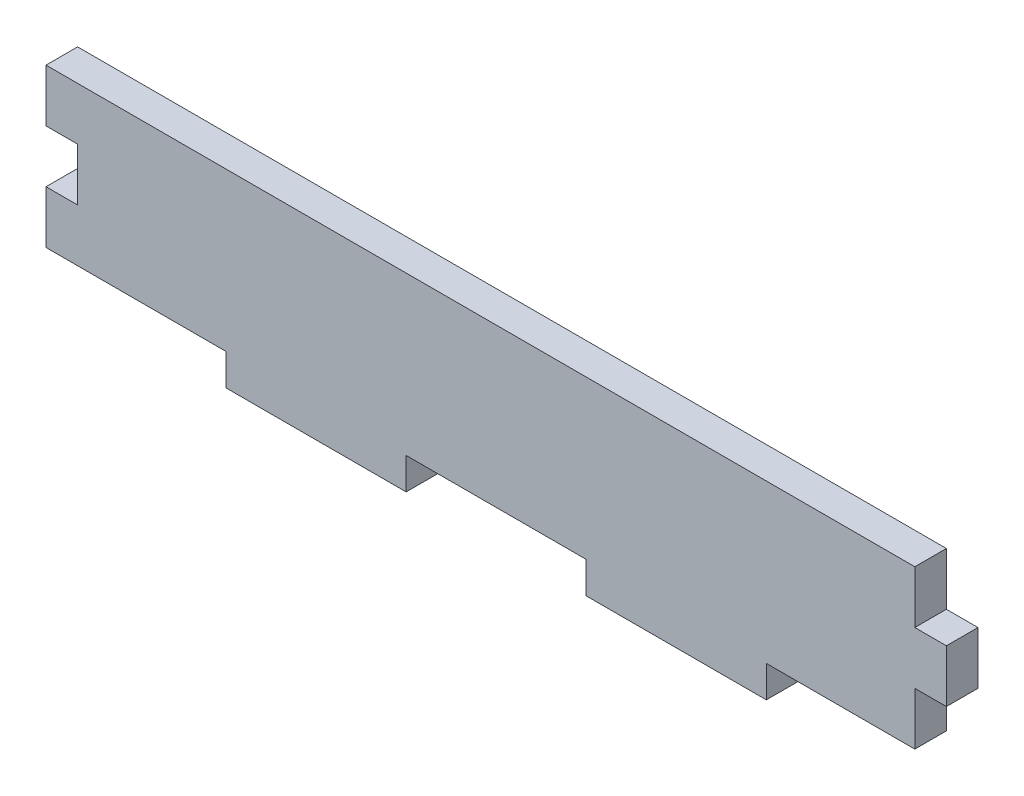
ISO-10303-21;
HEADER;
FILE_DESCRIPTION(('STEP AP214'),'2;1');
FILE_NAME('part.step','',(''),(''),'','','');
FILE_SCHEMA(('AUTOMOTIVE_DESIGN { 1 0 10303 214 1 1 1 1 }'));
ENDSEC;
DATA;
#1=APPLICATION_CONTEXT('core data for automotive mechanical design processes');
#2=APPLICATION_PROTOCOL_DEFINITION('international standard','automotive_design',2000,#1);
#3=PRODUCT_CONTEXT('',#1,'mechanical');
#4=PRODUCT('Part','Part','',(#3));
#5=PRODUCT_RELATED_PRODUCT_CATEGORY('part','',(#4));
#6=PRODUCT_DEFINITION_FORMATION('','',#4);
#7=PRODUCT_DEFINITION_CONTEXT('part definition',#1,'design');
#8=PRODUCT_DEFINITION('design','',#6,#7);
#9=PRODUCT_DEFINITION_SHAPE('','',#8);
#10=(LENGTH_UNIT() NAMED_UNIT(*) SI_UNIT(.MILLI.,.METRE.));
#11=(NAMED_UNIT(*) PLANE_ANGLE_UNIT() SI_UNIT($,.RADIAN.));
#12=(NAMED_UNIT(*) SI_UNIT($,.STERADIAN.) SOLID_ANGLE_UNIT());
#13=UNCERTAINTY_MEASURE_WITH_UNIT(LENGTH_MEASURE(1.E-05),#10,'distance_accuracy_value','');
#14=(GEOMETRIC_REPRESENTATION_CONTEXT(3) GLOBAL_UNCERTAINTY_ASSIGNED_CONTEXT((#13)) GLOBAL_UNIT_ASSIGNED_CONTEXT((#10,
#11,#12)) REPRESENTATION_CONTEXT('',''));
#15=CARTESIAN_POINT('',(0.,0.,0.));
#16=DIRECTION('',(0.,0.,1.));
#17=DIRECTION('',(1.,0.,0.));
#18=AXIS2_PLACEMENT_3D('',#15,#16,#17);
#19=CARTESIAN_POINT('',(0.,0.,5.08));
#20=DIRECTION('',(1.,0.,0.));
#21=DIRECTION('',(0.,0.,-1.));
#22=AXIS2_PLACEMENT_3D('',#19,#20,#21);
#23=PLANE('',#22);
#24=DIRECTION('',(0.,-1.,0.));
#25=VECTOR('',#24,1.);
#26=CARTESIAN_POINT('',(0.,0.,0.));
#27=LINE('',#26,#25);
#28=CARTESIAN_POINT('',(0.,30.48,0.));
#29=VERTEX_POINT('',#28);
#30=CARTESIAN_POINT('',(0.,22.0133333333333,0.));
#31=VERTEX_POINT('',#30);
#32=EDGE_CURVE('E193',#29,#31,#27,.T.);
#33=ORIENTED_EDGE('',*,*,#32,.T.);
#34=DIRECTION('',(0.,0.,1.));
#35=VECTOR('',#34,1.);
#36=CARTESIAN_POINT('',(0.,22.0133333333333,0.));
#37=LINE('',#36,#35);
#38=CARTESIAN_POINT('',(0.,22.0133333333333,5.08));
#39=VERTEX_POINT('',#38);
#40=EDGE_CURVE('E269',#31,#39,#37,.T.);
#41=ORIENTED_EDGE('',*,*,#40,.T.);
#42=DIRECTION('',(0.,-1.,0.));
#43=VECTOR('',#42,1.);
#44=CARTESIAN_POINT('',(0.,0.,5.08));
#45=LINE('',#44,#43);
#46=CARTESIAN_POINT('',(0.,30.48,5.08));
#47=VERTEX_POINT('',#46);
#48=EDGE_CURVE('E213',#47,#39,#45,.T.);
#49=ORIENTED_EDGE('',*,*,#48,.F.);
#50=DIRECTION('',(0.,0.,-1.));
#51=VECTOR('',#50,1.);
#52=CARTESIAN_POINT('',(0.,30.48,5.08));
#53=LINE('',#52,#51);
#54=EDGE_CURVE('E11',#47,#29,#53,.T.);
#55=ORIENTED_EDGE('',*,*,#54,.T.);
#56=EDGE_LOOP('',(#33,#41,#49,#55));
#57=FACE_BOUND('',#56,.T.);
#58=ADVANCED_FACE('F33',(#57),#23,.F.);
#59=CARTESIAN_POINT('',(0.,0.,5.08));
#60=DIRECTION('',(0.,1.,0.));
#61=DIRECTION('',(0.,0.,1.));
#62=AXIS2_PLACEMENT_3D('',#59,#60,#61);
#63=PLANE('',#62);
#64=DIRECTION('',(1.,0.,0.));
#65=VECTOR('',#64,1.);
#66=CARTESIAN_POINT('',(0.,0.,5.08));
#67=LINE('',#66,#65);
#68=CARTESIAN_POINT('',(28.956,0.,5.08));
#69=VERTEX_POINT('',#68);
#70=CARTESIAN_POINT('',(57.912,0.,5.08));
#71=VERTEX_POINT('',#70);
#72=EDGE_CURVE('E225',#69,#71,#67,.T.);
#73=ORIENTED_EDGE('',*,*,#72,.F.);
#74=DIRECTION('',(0.,0.,1.));
#75=VECTOR('',#74,1.);
#76=CARTESIAN_POINT('',(28.956,0.,0.));
#77=LINE('',#76,#75);
#78=CARTESIAN_POINT('',(28.956,0.,0.));
#79=VERTEX_POINT('',#78);
#80=EDGE_CURVE('E245',#79,#69,#77,.T.);
#81=ORIENTED_EDGE('',*,*,#80,.F.);
#82=DIRECTION('',(1.,0.,0.));
#83=VECTOR('',#82,1.);
#84=CARTESIAN_POINT('',(0.,0.,0.));
#85=LINE('',#84,#83);
#86=CARTESIAN_POINT('',(57.912,0.,0.));
#87=VERTEX_POINT('',#86);
#88=EDGE_CURVE('E205',#79,#87,#85,.T.);
#89=ORIENTED_EDGE('',*,*,#88,.T.);
#90=DIRECTION('',(0.,0.,1.));
#91=VECTOR('',#90,1.);
#92=CARTESIAN_POINT('',(57.912,0.,0.));
#93=LINE('',#92,#91);
#94=EDGE_CURVE('E247',#87,#71,#93,.T.);
#95=ORIENTED_EDGE('',*,*,#94,.T.);
#96=EDGE_LOOP('',(#73,#81,#89,#95));
#97=FACE_BOUND('',#96,.T.);
#98=ADVANCED_FACE('F243',(#97),#63,.F.);
#99=CARTESIAN_POINT('',(0.,13.5466666666667,5.08));
#100=VERTEX_POINT('',#99);
#101=CARTESIAN_POINT('',(0.,5.08,5.08));
#102=VERTEX_POINT('',#101);
#103=EDGE_CURVE('E185',#100,#102,#45,.T.);
#104=ORIENTED_EDGE('',*,*,#103,.F.);
#105=DIRECTION('',(0.,0.,1.));
#106=VECTOR('',#105,1.);
#107=CARTESIAN_POINT('',(0.,13.5466666666667,0.));
#108=LINE('',#107,#106);
#109=CARTESIAN_POINT('',(0.,13.5466666666667,0.));
#110=VERTEX_POINT('',#109);
#111=EDGE_CURVE('E173',#110,#100,#108,.T.);
#112=ORIENTED_EDGE('',*,*,#111,.F.);
#113=CARTESIAN_POINT('',(0.,5.08,0.));
#114=VERTEX_POINT('',#113);
#115=EDGE_CURVE('E183',#110,#114,#27,.T.);
#116=ORIENTED_EDGE('',*,*,#115,.T.);
#117=DIRECTION('',(0.,0.,1.));
#118=VECTOR('',#117,1.);
#119=CARTESIAN_POINT('',(0.,5.08,0.));
#120=LINE('',#119,#118);
#121=EDGE_CURVE('E194',#114,#102,#120,.T.);
#122=ORIENTED_EDGE('',*,*,#121,.T.);
#123=EDGE_LOOP('',(#104,#112,#116,#122));
#124=FACE_BOUND('',#123,.T.);
#125=ADVANCED_FACE('F35',(#124),#23,.F.);
#126=CARTESIAN_POINT('',(86.868,0.,5.08));
#127=VERTEX_POINT('',#126);
#128=CARTESIAN_POINT('',(115.824,0.,5.08));
#129=VERTEX_POINT('',#128);
#130=EDGE_CURVE('E219',#127,#129,#67,.T.);
#131=ORIENTED_EDGE('',*,*,#130,.F.);
#132=DIRECTION('',(0.,0.,1.));
#133=VECTOR('',#132,1.);
#134=CARTESIAN_POINT('',(86.868,0.,0.));
#135=LINE('',#134,#133);
#136=CARTESIAN_POINT('',(86.868,0.,0.));
#137=VERTEX_POINT('',#136);
#138=EDGE_CURVE('E251',#137,#127,#135,.T.);
#139=ORIENTED_EDGE('',*,*,#138,.F.);
#140=CARTESIAN_POINT('',(115.824,0.,0.));
#141=VERTEX_POINT('',#140);
#142=EDGE_CURVE('E197',#137,#141,#85,.T.);
#143=ORIENTED_EDGE('',*,*,#142,.T.);
#144=DIRECTION('',(0.,0.,1.));
#145=VECTOR('',#144,1.);
#146=CARTESIAN_POINT('',(115.824,0.,0.));
#147=LINE('',#146,#145);
#148=EDGE_CURVE('E270',#141,#129,#147,.T.);
#149=ORIENTED_EDGE('',*,*,#148,.T.);
#150=EDGE_LOOP('',(#131,#139,#143,#149));
#151=FACE_BOUND('',#150,.T.);
#152=ADVANCED_FACE('F289',(#151),#63,.F.);
#153=CARTESIAN_POINT('',(144.78,0.,5.08));
#154=DIRECTION('',(-1.,0.,0.));
#155=DIRECTION('',(0.,0.,1.));
#156=AXIS2_PLACEMENT_3D('',#153,#154,#155);
#157=PLANE('',#156);
#158=DIRECTION('',(0.,1.,0.));
#159=VECTOR('',#158,1.);
#160=CARTESIAN_POINT('',(144.78,0.,0.));
#161=LINE('',#160,#159);
#162=CARTESIAN_POINT('',(144.78,13.5466666666667,0.));
#163=VERTEX_POINT('',#162);
#164=CARTESIAN_POINT('',(144.78,22.0133333333333,0.));
#165=VERTEX_POINT('',#164);
#166=EDGE_CURVE('E206',#163,#165,#161,.T.);
#167=ORIENTED_EDGE('',*,*,#166,.T.);
#168=DIRECTION('',(0.,0.,1.));
#169=VECTOR('',#168,1.);
#170=CARTESIAN_POINT('',(144.78,22.0133333333333,0.));
#171=LINE('',#170,#169);
#172=CARTESIAN_POINT('',(144.78,22.0133333333333,5.08));
#173=VERTEX_POINT('',#172);
#174=EDGE_CURVE('E426',#165,#173,#171,.T.);
#175=ORIENTED_EDGE('',*,*,#174,.T.);
#176=DIRECTION('',(0.,1.,0.));
#177=VECTOR('',#176,1.);
#178=CARTESIAN_POINT('',(144.78,0.,5.08));
#179=LINE('',#178,#177);
#180=CARTESIAN_POINT('',(144.78,13.5466666666667,5.08));
#181=VERTEX_POINT('',#180);
#182=EDGE_CURVE('E226',#181,#173,#179,.T.);
#183=ORIENTED_EDGE('',*,*,#182,.F.);
#184=DIRECTION('',(0.,0.,1.));
#185=VECTOR('',#184,1.);
#186=CARTESIAN_POINT('',(144.78,13.5466666666667,0.));
#187=LINE('',#186,#185);
#188=EDGE_CURVE('E307',#163,#181,#187,.T.);
#189=ORIENTED_EDGE('',*,*,#188,.F.);
#190=EDGE_LOOP('',(#167,#175,#183,#189));
#191=FACE_BOUND('',#190,.T.);
#192=ADVANCED_FACE('F356',(#191),#157,.F.);
#193=CARTESIAN_POINT('',(0.,30.48,5.08));
#194=DIRECTION('',(0.,-1.,0.));
#195=DIRECTION('',(0.,0.,-1.));
#196=AXIS2_PLACEMENT_3D('',#193,#194,#195);
#197=PLANE('',#196);
#198=DIRECTION('',(-1.,0.,0.));
#199=VECTOR('',#198,1.);
#200=CARTESIAN_POINT('',(0.,30.48,5.08));
#201=LINE('',#200,#199);
#202=CARTESIAN_POINT('',(139.7,30.48,5.08));
#203=VERTEX_POINT('',#202);
#204=EDGE_CURVE('E41',#203,#47,#201,.T.);
#205=ORIENTED_EDGE('',*,*,#204,.F.);
#206=DIRECTION('',(0.,0.,1.));
#207=VECTOR('',#206,1.);
#208=CARTESIAN_POINT('',(139.7,30.48,0.));
#209=LINE('',#208,#207);
#210=CARTESIAN_POINT('',(139.7,30.48,0.));
#211=VERTEX_POINT('',#210);
#212=EDGE_CURVE('E432',#211,#203,#209,.T.);
#213=ORIENTED_EDGE('',*,*,#212,.F.);
#214=DIRECTION('',(-1.,0.,0.));
#215=VECTOR('',#214,1.);
#216=CARTESIAN_POINT('',(0.,30.48,0.));
#217=LINE('',#216,#215);
#218=EDGE_CURVE('E208',#211,#29,#217,.T.);
#219=ORIENTED_EDGE('',*,*,#218,.T.);
#220=ORIENTED_EDGE('',*,*,#54,.F.);
#221=EDGE_LOOP('',(#205,#213,#219,#220));
#222=FACE_BOUND('',#221,.T.);
#223=ADVANCED_FACE('F360',(#222),#197,.F.);
#224=CARTESIAN_POINT('',(0.,0.,5.08));
#225=DIRECTION('',(0.,0.,-1.));
#226=DIRECTION('',(-1.,0.,0.));
#227=AXIS2_PLACEMENT_3D('',#224,#225,#226);
#228=PLANE('',#227);
#229=ORIENTED_EDGE('',*,*,#48,.T.);
#230=DIRECTION('',(-1.,0.,0.));
#231=VECTOR('',#230,1.);
#232=CARTESIAN_POINT('',(0.,22.0133333333333,5.08));
#233=LINE('',#232,#231);
#234=CARTESIAN_POINT('',(5.08,22.0133333333333,5.08));
#235=VERTEX_POINT('',#234);
#236=EDGE_CURVE('E178',#235,#39,#233,.T.);
#237=ORIENTED_EDGE('',*,*,#236,.F.);
#238=DIRECTION('',(0.,1.,0.));
#239=VECTOR('',#238,1.);
#240=CARTESIAN_POINT('',(5.08,22.0133333333333,5.08));
#241=LINE('',#240,#239);
#242=CARTESIAN_POINT('',(5.08,13.5466666666667,5.08));
#243=VERTEX_POINT('',#242);
#244=EDGE_CURVE('E413',#243,#235,#241,.T.);
#245=ORIENTED_EDGE('',*,*,#244,.F.);
#246=DIRECTION('',(1.,0.,0.));
#247=VECTOR('',#246,1.);
#248=CARTESIAN_POINT('',(0.,13.5466666666667,5.08));
#249=LINE('',#248,#247);
#250=EDGE_CURVE('E424',#100,#243,#249,.T.);
#251=ORIENTED_EDGE('',*,*,#250,.F.);
#252=ORIENTED_EDGE('',*,*,#103,.T.);
#253=DIRECTION('',(-1.,0.,0.));
#254=VECTOR('',#253,1.);
#255=CARTESIAN_POINT('',(0.,5.08,5.08));
#256=LINE('',#255,#254);
#257=CARTESIAN_POINT('',(28.956,5.08,5.08));
#258=VERTEX_POINT('',#257);
#259=EDGE_CURVE('E316',#258,#102,#256,.T.);
#260=ORIENTED_EDGE('',*,*,#259,.F.);
#261=DIRECTION('',(0.,1.,0.));
#262=VECTOR('',#261,1.);
#263=CARTESIAN_POINT('',(28.956,5.08,5.08));
#264=LINE('',#263,#262);
#265=EDGE_CURVE('E239',#69,#258,#264,.T.);
#266=ORIENTED_EDGE('',*,*,#265,.F.);
#267=ORIENTED_EDGE('',*,*,#72,.T.);
#268=DIRECTION('',(0.,-1.,0.));
#269=VECTOR('',#268,1.);
#270=CARTESIAN_POINT('',(57.912,0.,5.08));
#271=LINE('',#270,#269);
#272=CARTESIAN_POINT('',(57.912,5.08,5.08));
#273=VERTEX_POINT('',#272);
#274=EDGE_CURVE('E237',#273,#71,#271,.T.);
#275=ORIENTED_EDGE('',*,*,#274,.F.);
#276=DIRECTION('',(-1.,0.,0.));
#277=VECTOR('',#276,1.);
#278=CARTESIAN_POINT('',(57.912,5.08,5.08));
#279=LINE('',#278,#277);
#280=CARTESIAN_POINT('',(86.868,5.08,5.08));
#281=VERTEX_POINT('',#280);
#282=EDGE_CURVE('E325',#281,#273,#279,.T.);
#283=ORIENTED_EDGE('',*,*,#282,.F.);
#284=DIRECTION('',(0.,1.,0.));
#285=VECTOR('',#284,1.);
#286=CARTESIAN_POINT('',(86.868,0.,5.08));
#287=LINE('',#286,#285);
#288=EDGE_CURVE('E274',#127,#281,#287,.T.);
#289=ORIENTED_EDGE('',*,*,#288,.F.);
#290=ORIENTED_EDGE('',*,*,#130,.T.);
#291=DIRECTION('',(0.,-1.,0.));
#292=VECTOR('',#291,1.);
#293=CARTESIAN_POINT('',(115.824,0.,5.08));
#294=LINE('',#293,#292);
#295=CARTESIAN_POINT('',(115.824,5.08,5.08));
#296=VERTEX_POINT('',#295);
#297=EDGE_CURVE('E264',#296,#129,#294,.T.);
#298=ORIENTED_EDGE('',*,*,#297,.F.);
#299=DIRECTION('',(-1.,0.,0.));
#300=VECTOR('',#299,1.);
#301=CARTESIAN_POINT('',(144.78,5.08,5.08));
#302=LINE('',#301,#300);
#303=CARTESIAN_POINT('',(139.7,5.08,5.08));
#304=VERTEX_POINT('',#303);
#305=EDGE_CURVE('E267',#304,#296,#302,.T.);
#306=ORIENTED_EDGE('',*,*,#305,.F.);
#307=DIRECTION('',(0.,-1.,0.));
#308=VECTOR('',#307,1.);
#309=CARTESIAN_POINT('',(139.7,5.08,5.08));
#310=LINE('',#309,#308);
#311=CARTESIAN_POINT('',(139.7,13.5466666666667,5.08));
#312=VERTEX_POINT('',#311);
#313=EDGE_CURVE('E310',#312,#304,#310,.T.);
#314=ORIENTED_EDGE('',*,*,#313,.F.);
#315=DIRECTION('',(-1.,0.,0.));
#316=VECTOR('',#315,1.);
#317=CARTESIAN_POINT('',(144.78,13.5466666666667,5.08));
#318=LINE('',#317,#316);
#319=EDGE_CURVE('E442',#181,#312,#318,.T.);
#320=ORIENTED_EDGE('',*,*,#319,.F.);
#321=ORIENTED_EDGE('',*,*,#182,.T.);
#322=DIRECTION('',(1.,0.,0.));
#323=VECTOR('',#322,1.);
#324=CARTESIAN_POINT('',(144.78,22.0133333333333,5.08));
#325=LINE('',#324,#323);
#326=CARTESIAN_POINT('',(139.7,22.0133333333333,5.08));
#327=VERTEX_POINT('',#326);
#328=EDGE_CURVE('E305',#327,#173,#325,.T.);
#329=ORIENTED_EDGE('',*,*,#328,.F.);
#330=DIRECTION('',(0.,-1.,0.));
#331=VECTOR('',#330,1.);
#332=CARTESIAN_POINT('',(139.7,30.48,5.08));
#333=LINE('',#332,#331);
#334=EDGE_CURVE('E301',#203,#327,#333,.T.);
#335=ORIENTED_EDGE('',*,*,#334,.F.);
#336=ORIENTED_EDGE('',*,*,#204,.T.);
#337=EDGE_LOOP('',(#229,#237,#245,#251,#252,#260,#266,#267,#275,#283,#289,#290,#298,#306,#314,
#320,#321,#329,#335,#336));
#338=FACE_BOUND('',#337,.T.);
#339=ADVANCED_FACE('F235',(#338),#228,.F.);
#340=CARTESIAN_POINT('',(0.,0.,0.));
#341=DIRECTION('',(0.,0.,-1.));
#342=DIRECTION('',(-1.,0.,0.));
#343=AXIS2_PLACEMENT_3D('',#340,#341,#342);
#344=PLANE('',#343);
#345=DIRECTION('',(-1.,0.,0.));
#346=VECTOR('',#345,1.);
#347=CARTESIAN_POINT('',(0.,22.0133333333333,0.));
#348=LINE('',#347,#346);
#349=CARTESIAN_POINT('',(5.08,22.0133333333333,0.));
#350=VERTEX_POINT('',#349);
#351=EDGE_CURVE('E186',#350,#31,#348,.T.);
#352=ORIENTED_EDGE('',*,*,#351,.T.);
#353=ORIENTED_EDGE('',*,*,#32,.F.);
#354=ORIENTED_EDGE('',*,*,#218,.F.);
#355=DIRECTION('',(0.,-1.,0.));
#356=VECTOR('',#355,1.);
#357=CARTESIAN_POINT('',(139.7,30.48,0.));
#358=LINE('',#357,#356);
#359=CARTESIAN_POINT('',(139.7,22.0133333333333,0.));
#360=VERTEX_POINT('',#359);
#361=EDGE_CURVE('E430',#211,#360,#358,.T.);
#362=ORIENTED_EDGE('',*,*,#361,.T.);
#363=DIRECTION('',(1.,0.,0.));
#364=VECTOR('',#363,1.);
#365=CARTESIAN_POINT('',(144.78,22.0133333333333,0.));
#366=LINE('',#365,#364);
#367=EDGE_CURVE('E56',#360,#165,#366,.T.);
#368=ORIENTED_EDGE('',*,*,#367,.T.);
#369=ORIENTED_EDGE('',*,*,#166,.F.);
#370=DIRECTION('',(-1.,0.,0.));
#371=VECTOR('',#370,1.);
#372=CARTESIAN_POINT('',(144.78,13.5466666666667,0.));
#373=LINE('',#372,#371);
#374=CARTESIAN_POINT('',(139.7,13.5466666666667,0.));
#375=VERTEX_POINT('',#374);
#376=EDGE_CURVE('E440',#163,#375,#373,.T.);
#377=ORIENTED_EDGE('',*,*,#376,.T.);
#378=DIRECTION('',(0.,-1.,0.));
#379=VECTOR('',#378,1.);
#380=CARTESIAN_POINT('',(139.7,5.08,0.));
#381=LINE('',#380,#379);
#382=CARTESIAN_POINT('',(139.7,5.08,0.));
#383=VERTEX_POINT('',#382);
#384=EDGE_CURVE('E296',#375,#383,#381,.T.);
#385=ORIENTED_EDGE('',*,*,#384,.T.);
#386=DIRECTION('',(-1.,0.,0.));
#387=VECTOR('',#386,1.);
#388=CARTESIAN_POINT('',(144.78,5.08,0.));
#389=LINE('',#388,#387);
#390=CARTESIAN_POINT('',(115.824,5.08,0.));
#391=VERTEX_POINT('',#390);
#392=EDGE_CURVE('E261',#383,#391,#389,.T.);
#393=ORIENTED_EDGE('',*,*,#392,.T.);
#394=DIRECTION('',(0.,-1.,0.));
#395=VECTOR('',#394,1.);
#396=CARTESIAN_POINT('',(115.824,0.,0.));
#397=LINE('',#396,#395);
#398=EDGE_CURVE('E263',#391,#141,#397,.T.);
#399=ORIENTED_EDGE('',*,*,#398,.T.);
#400=ORIENTED_EDGE('',*,*,#142,.F.);
#401=DIRECTION('',(0.,1.,0.));
#402=VECTOR('',#401,1.);
#403=CARTESIAN_POINT('',(86.868,0.,0.));
#404=LINE('',#403,#402);
#405=CARTESIAN_POINT('',(86.868,5.08,0.));
#406=VERTEX_POINT('',#405);
#407=EDGE_CURVE('E257',#137,#406,#404,.T.);
#408=ORIENTED_EDGE('',*,*,#407,.T.);
#409=DIRECTION('',(-1.,0.,0.));
#410=VECTOR('',#409,1.);
#411=CARTESIAN_POINT('',(57.912,5.08,0.));
#412=LINE('',#411,#410);
#413=CARTESIAN_POINT('',(57.912,5.08,0.));
#414=VERTEX_POINT('',#413);
#415=EDGE_CURVE('E252',#406,#414,#412,.T.);
#416=ORIENTED_EDGE('',*,*,#415,.T.);
#417=DIRECTION('',(0.,-1.,0.));
#418=VECTOR('',#417,1.);
#419=CARTESIAN_POINT('',(57.912,0.,0.));
#420=LINE('',#419,#418);
#421=EDGE_CURVE('E323',#414,#87,#420,.T.);
#422=ORIENTED_EDGE('',*,*,#421,.T.);
#423=ORIENTED_EDGE('',*,*,#88,.F.);
#424=DIRECTION('',(0.,1.,0.));
#425=VECTOR('',#424,1.);
#426=CARTESIAN_POINT('',(28.956,5.08,0.));
#427=LINE('',#426,#425);
#428=CARTESIAN_POINT('',(28.956,5.08,0.));
#429=VERTEX_POINT('',#428);
#430=EDGE_CURVE('E314',#79,#429,#427,.T.);
#431=ORIENTED_EDGE('',*,*,#430,.T.);
#432=DIRECTION('',(-1.,0.,0.));
#433=VECTOR('',#432,1.);
#434=CARTESIAN_POINT('',(0.,5.08,0.));
#435=LINE('',#434,#433);
#436=EDGE_CURVE('E192',#429,#114,#435,.T.);
#437=ORIENTED_EDGE('',*,*,#436,.T.);
#438=ORIENTED_EDGE('',*,*,#115,.F.);
#439=DIRECTION('',(1.,0.,0.));
#440=VECTOR('',#439,1.);
#441=CARTESIAN_POINT('',(0.,13.5466666666667,0.));
#442=LINE('',#441,#440);
#443=CARTESIAN_POINT('',(5.08,13.5466666666667,0.));
#444=VERTEX_POINT('',#443);
#445=EDGE_CURVE('E169',#110,#444,#442,.T.);
#446=ORIENTED_EDGE('',*,*,#445,.T.);
#447=DIRECTION('',(0.,1.,0.));
#448=VECTOR('',#447,1.);
#449=CARTESIAN_POINT('',(5.08,22.0133333333333,0.));
#450=LINE('',#449,#448);
#451=EDGE_CURVE('E48',#444,#350,#450,.T.);
#452=ORIENTED_EDGE('',*,*,#451,.T.);
#453=EDGE_LOOP('',(#352,#353,#354,#362,#368,#369,#377,#385,#393,#399,#400,#408,#416,#422,#423,
#431,#437,#438,#446,#452));
#454=FACE_BOUND('',#453,.T.);
#455=ADVANCED_FACE('F190',(#454),#344,.T.);
#456=CARTESIAN_POINT('',(115.824,0.,0.));
#457=DIRECTION('',(-1.,0.,0.));
#458=DIRECTION('',(0.,0.,1.));
#459=AXIS2_PLACEMENT_3D('',#456,#457,#458);
#460=PLANE('',#459);
#461=ORIENTED_EDGE('',*,*,#297,.T.);
#462=ORIENTED_EDGE('',*,*,#148,.F.);
#463=ORIENTED_EDGE('',*,*,#398,.F.);
#464=DIRECTION('',(0.,0.,1.));
#465=VECTOR('',#464,1.);
#466=CARTESIAN_POINT('',(115.824,5.08,0.));
#467=LINE('',#466,#465);
#468=EDGE_CURVE('E222',#391,#296,#467,.T.);
#469=ORIENTED_EDGE('',*,*,#468,.T.);
#470=EDGE_LOOP('',(#461,#462,#463,#469));
#471=FACE_BOUND('',#470,.T.);
#472=ADVANCED_FACE('F281',(#471),#460,.F.);
#473=CARTESIAN_POINT('',(144.78,5.08,0.));
#474=DIRECTION('',(0.,1.,0.));
#475=DIRECTION('',(0.,0.,1.));
#476=AXIS2_PLACEMENT_3D('',#473,#474,#475);
#477=PLANE('',#476);
#478=ORIENTED_EDGE('',*,*,#392,.F.);
#479=DIRECTION('',(0.,0.,1.));
#480=VECTOR('',#479,1.);
#481=CARTESIAN_POINT('',(139.7,5.08,0.));
#482=LINE('',#481,#480);
#483=EDGE_CURVE('E299',#383,#304,#482,.T.);
#484=ORIENTED_EDGE('',*,*,#483,.T.);
#485=ORIENTED_EDGE('',*,*,#305,.T.);
#486=ORIENTED_EDGE('',*,*,#468,.F.);
#487=EDGE_LOOP('',(#478,#484,#485,#486));
#488=FACE_BOUND('',#487,.T.);
#489=ADVANCED_FACE('F298',(#488),#477,.F.);
#490=CARTESIAN_POINT('',(57.912,0.,0.));
#491=DIRECTION('',(-1.,0.,0.));
#492=DIRECTION('',(0.,0.,1.));
#493=AXIS2_PLACEMENT_3D('',#490,#491,#492);
#494=PLANE('',#493);
#495=ORIENTED_EDGE('',*,*,#274,.T.);
#496=ORIENTED_EDGE('',*,*,#94,.F.);
#497=ORIENTED_EDGE('',*,*,#421,.F.);
#498=DIRECTION('',(0.,0.,1.));
#499=VECTOR('',#498,1.);
#500=CARTESIAN_POINT('',(57.912,5.08,0.));
#501=LINE('',#500,#499);
#502=EDGE_CURVE('E319',#414,#273,#501,.T.);
#503=ORIENTED_EDGE('',*,*,#502,.T.);
#504=EDGE_LOOP('',(#495,#496,#497,#503));
#505=FACE_BOUND('',#504,.T.);
#506=ADVANCED_FACE('F344',(#505),#494,.F.);
#507=CARTESIAN_POINT('',(57.912,5.08,0.));
#508=DIRECTION('',(0.,1.,0.));
#509=DIRECTION('',(0.,0.,1.));
#510=AXIS2_PLACEMENT_3D('',#507,#508,#509);
#511=PLANE('',#510);
#512=ORIENTED_EDGE('',*,*,#282,.T.);
#513=ORIENTED_EDGE('',*,*,#502,.F.);
#514=ORIENTED_EDGE('',*,*,#415,.F.);
#515=DIRECTION('',(0.,0.,1.));
#516=VECTOR('',#515,1.);
#517=CARTESIAN_POINT('',(86.868,5.08,0.));
#518=LINE('',#517,#516);
#519=EDGE_CURVE('E254',#406,#281,#518,.T.);
#520=ORIENTED_EDGE('',*,*,#519,.T.);
#521=EDGE_LOOP('',(#512,#513,#514,#520));
#522=FACE_BOUND('',#521,.T.);
#523=ADVANCED_FACE('F332',(#522),#511,.F.);
#524=CARTESIAN_POINT('',(86.868,0.,0.));
#525=DIRECTION('',(1.,0.,0.));
#526=DIRECTION('',(0.,0.,-1.));
#527=AXIS2_PLACEMENT_3D('',#524,#525,#526);
#528=PLANE('',#527);
#529=ORIENTED_EDGE('',*,*,#288,.T.);
#530=ORIENTED_EDGE('',*,*,#519,.F.);
#531=ORIENTED_EDGE('',*,*,#407,.F.);
#532=ORIENTED_EDGE('',*,*,#138,.T.);
#533=EDGE_LOOP('',(#529,#530,#531,#532));
#534=FACE_BOUND('',#533,.T.);
#535=ADVANCED_FACE('F333',(#534),#528,.F.);
#536=CARTESIAN_POINT('',(0.,5.08,0.));
#537=DIRECTION('',(0.,1.,0.));
#538=DIRECTION('',(0.,0.,1.));
#539=AXIS2_PLACEMENT_3D('',#536,#537,#538);
#540=PLANE('',#539);
#541=ORIENTED_EDGE('',*,*,#259,.T.);
#542=ORIENTED_EDGE('',*,*,#121,.F.);
#543=ORIENTED_EDGE('',*,*,#436,.F.);
#544=DIRECTION('',(0.,0.,1.));
#545=VECTOR('',#544,1.);
#546=CARTESIAN_POINT('',(28.956,5.08,0.));
#547=LINE('',#546,#545);
#548=EDGE_CURVE('E198',#429,#258,#547,.T.);
#549=ORIENTED_EDGE('',*,*,#548,.T.);
#550=EDGE_LOOP('',(#541,#542,#543,#549));
#551=FACE_BOUND('',#550,.T.);
#552=ADVANCED_FACE('F335',(#551),#540,.F.);
#553=CARTESIAN_POINT('',(28.956,5.08,0.));
#554=DIRECTION('',(1.,0.,0.));
#555=DIRECTION('',(0.,0.,-1.));
#556=AXIS2_PLACEMENT_3D('',#553,#554,#555);
#557=PLANE('',#556);
#558=ORIENTED_EDGE('',*,*,#265,.T.);
#559=ORIENTED_EDGE('',*,*,#548,.F.);
#560=ORIENTED_EDGE('',*,*,#430,.F.);
#561=ORIENTED_EDGE('',*,*,#80,.T.);
#562=EDGE_LOOP('',(#558,#559,#560,#561));
#563=FACE_BOUND('',#562,.T.);
#564=ADVANCED_FACE('F341',(#563),#557,.F.);
#565=CARTESIAN_POINT('',(139.7,5.08,0.));
#566=DIRECTION('',(-1.,0.,0.));
#567=DIRECTION('',(0.,0.,1.));
#568=AXIS2_PLACEMENT_3D('',#565,#566,#567);
#569=PLANE('',#568);
#570=ORIENTED_EDGE('',*,*,#313,.T.);
#571=ORIENTED_EDGE('',*,*,#483,.F.);
#572=ORIENTED_EDGE('',*,*,#384,.F.);
#573=DIRECTION('',(0.,0.,1.));
#574=VECTOR('',#573,1.);
#575=CARTESIAN_POINT('',(139.7,13.5466666666667,0.));
#576=LINE('',#575,#574);
#577=EDGE_CURVE('E302',#375,#312,#576,.T.);
#578=ORIENTED_EDGE('',*,*,#577,.T.);
#579=EDGE_LOOP('',(#570,#571,#572,#578));
#580=FACE_BOUND('',#579,.T.);
#581=ADVANCED_FACE('F379',(#580),#569,.F.);
#582=CARTESIAN_POINT('',(144.78,13.5466666666667,0.));
#583=DIRECTION('',(0.,1.,0.));
#584=DIRECTION('',(0.,0.,1.));
#585=AXIS2_PLACEMENT_3D('',#582,#583,#584);
#586=PLANE('',#585);
#587=ORIENTED_EDGE('',*,*,#319,.T.);
#588=ORIENTED_EDGE('',*,*,#577,.F.);
#589=ORIENTED_EDGE('',*,*,#376,.F.);
#590=ORIENTED_EDGE('',*,*,#188,.T.);
#591=EDGE_LOOP('',(#587,#588,#589,#590));
#592=FACE_BOUND('',#591,.T.);
#593=ADVANCED_FACE('F384',(#592),#586,.F.);
#594=CARTESIAN_POINT('',(144.78,22.0133333333333,0.));
#595=DIRECTION('',(0.,-1.,0.));
#596=DIRECTION('',(0.,0.,-1.));
#597=AXIS2_PLACEMENT_3D('',#594,#595,#596);
#598=PLANE('',#597);
#599=ORIENTED_EDGE('',*,*,#328,.T.);
#600=ORIENTED_EDGE('',*,*,#174,.F.);
#601=ORIENTED_EDGE('',*,*,#367,.F.);
#602=DIRECTION('',(0.,0.,1.));
#603=VECTOR('',#602,1.);
#604=CARTESIAN_POINT('',(139.7,22.0133333333333,0.));
#605=LINE('',#604,#603);
#606=EDGE_CURVE('E437',#360,#327,#605,.T.);
#607=ORIENTED_EDGE('',*,*,#606,.T.);
#608=EDGE_LOOP('',(#599,#600,#601,#607));
#609=FACE_BOUND('',#608,.T.);
#610=ADVANCED_FACE('F388',(#609),#598,.F.);
#611=CARTESIAN_POINT('',(139.7,30.48,0.));
#612=DIRECTION('',(-1.,0.,0.));
#613=DIRECTION('',(0.,0.,1.));
#614=AXIS2_PLACEMENT_3D('',#611,#612,#613);
#615=PLANE('',#614);
#616=ORIENTED_EDGE('',*,*,#334,.T.);
#617=ORIENTED_EDGE('',*,*,#606,.F.);
#618=ORIENTED_EDGE('',*,*,#361,.F.);
#619=ORIENTED_EDGE('',*,*,#212,.T.);
#620=EDGE_LOOP('',(#616,#617,#618,#619));
#621=FACE_BOUND('',#620,.T.);
#622=ADVANCED_FACE('F391',(#621),#615,.F.);
#623=CARTESIAN_POINT('',(0.,22.0133333333333,0.));
#624=DIRECTION('',(0.,1.,0.));
#625=DIRECTION('',(0.,0.,1.));
#626=AXIS2_PLACEMENT_3D('',#623,#624,#625);
#627=PLANE('',#626);
#628=ORIENTED_EDGE('',*,*,#236,.T.);
#629=ORIENTED_EDGE('',*,*,#40,.F.);
#630=ORIENTED_EDGE('',*,*,#351,.F.);
#631=DIRECTION('',(0.,0.,1.));
#632=VECTOR('',#631,1.);
#633=CARTESIAN_POINT('',(5.08,22.0133333333333,0.));
#634=LINE('',#633,#632);
#635=EDGE_CURVE('E410',#350,#235,#634,.T.);
#636=ORIENTED_EDGE('',*,*,#635,.T.);
#637=EDGE_LOOP('',(#628,#629,#630,#636));
#638=FACE_BOUND('',#637,.T.);
#639=ADVANCED_FACE('F394',(#638),#627,.F.);
#640=CARTESIAN_POINT('',(5.08,22.0133333333333,0.));
#641=DIRECTION('',(1.,0.,0.));
#642=DIRECTION('',(0.,1.,0.));
#643=AXIS2_PLACEMENT_3D('',#640,#641,#642);
#644=PLANE('',#643);
#645=ORIENTED_EDGE('',*,*,#244,.T.);
#646=ORIENTED_EDGE('',*,*,#635,.F.);
#647=ORIENTED_EDGE('',*,*,#451,.F.);
#648=DIRECTION('',(0.,0.,1.));
#649=VECTOR('',#648,1.);
#650=CARTESIAN_POINT('',(5.08,13.5466666666667,0.));
#651=LINE('',#650,#649);
#652=EDGE_CURVE('E175',#444,#243,#651,.T.);
#653=ORIENTED_EDGE('',*,*,#652,.T.);
#654=EDGE_LOOP('',(#645,#646,#647,#653));
#655=FACE_BOUND('',#654,.T.);
#656=ADVANCED_FACE('F400',(#655),#644,.F.);
#657=CARTESIAN_POINT('',(0.,13.5466666666667,0.));
#658=DIRECTION('',(0.,-1.,0.));
#659=DIRECTION('',(0.,0.,-1.));
#660=AXIS2_PLACEMENT_3D('',#657,#658,#659);
#661=PLANE('',#660);
#662=ORIENTED_EDGE('',*,*,#250,.T.);
#663=ORIENTED_EDGE('',*,*,#652,.F.);
#664=ORIENTED_EDGE('',*,*,#445,.F.);
#665=ORIENTED_EDGE('',*,*,#111,.T.);
#666=EDGE_LOOP('',(#662,#663,#664,#665));
#667=FACE_BOUND('',#666,.T.);
#668=ADVANCED_FACE('F172',(#667),#661,.F.);
#669=CLOSED_SHELL('',(#58,#98,#125,#152,#192,#223,#339,#455,#472,#489,#506,#523,#535,#552,#564,
#581,#593,#610,#622,#639,#656,#668));
#670=MANIFOLD_SOLID_BREP('B2',#669);
#671=ADVANCED_BREP_SHAPE_REPRESENTATION('',(#18,#670),#14);
#672=SHAPE_DEFINITION_REPRESENTATION(#9,#671);
ENDSEC;
END-ISO-10303-21;
